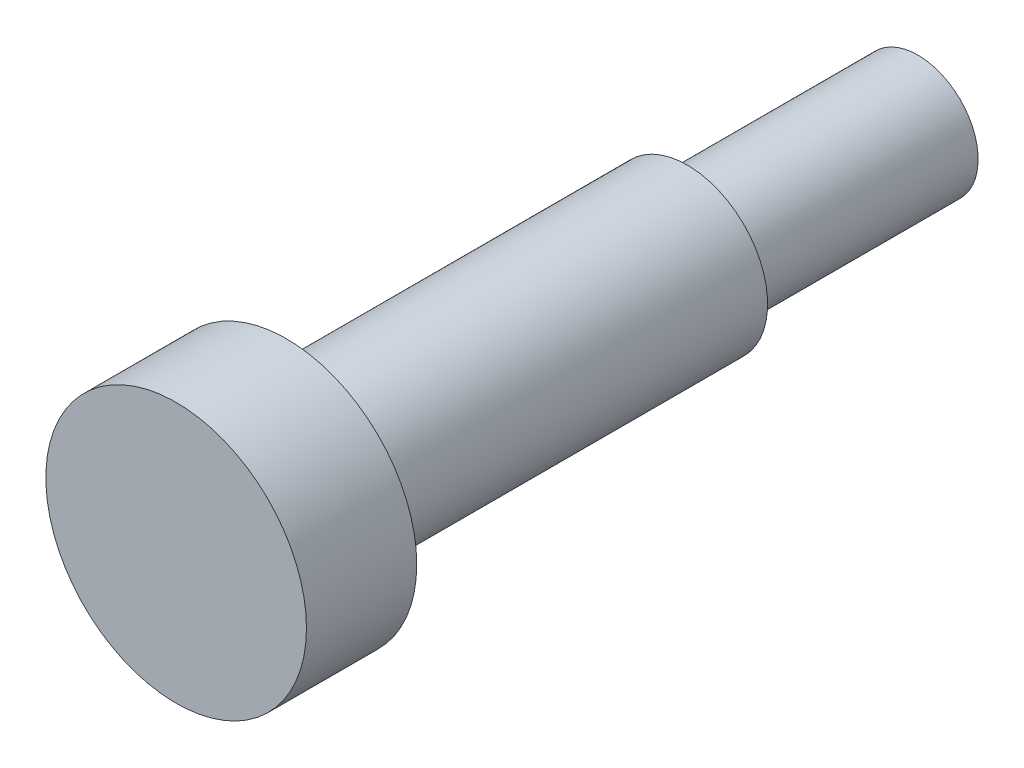
ISO-10303-21;
HEADER;
FILE_DESCRIPTION(('STEP AP214'),'2;1');
FILE_NAME('part.step','',(''),(''),'','','');
FILE_SCHEMA(('AUTOMOTIVE_DESIGN { 1 0 10303 214 1 1 1 1 }'));
ENDSEC;
DATA;
#1=APPLICATION_CONTEXT('core data for automotive mechanical design processes');
#2=APPLICATION_PROTOCOL_DEFINITION('international standard','automotive_design',2000,#1);
#3=PRODUCT_CONTEXT('',#1,'mechanical');
#4=PRODUCT('Part','Part','',(#3));
#5=PRODUCT_RELATED_PRODUCT_CATEGORY('part','',(#4));
#6=PRODUCT_DEFINITION_FORMATION('','',#4);
#7=PRODUCT_DEFINITION_CONTEXT('part definition',#1,'design');
#8=PRODUCT_DEFINITION('design','',#6,#7);
#9=PRODUCT_DEFINITION_SHAPE('','',#8);
#10=(LENGTH_UNIT() NAMED_UNIT(*) SI_UNIT(.MILLI.,.METRE.));
#11=(NAMED_UNIT(*) PLANE_ANGLE_UNIT() SI_UNIT($,.RADIAN.));
#12=(NAMED_UNIT(*) SI_UNIT($,.STERADIAN.) SOLID_ANGLE_UNIT());
#13=UNCERTAINTY_MEASURE_WITH_UNIT(LENGTH_MEASURE(1.E-05),#10,'distance_accuracy_value','');
#14=(GEOMETRIC_REPRESENTATION_CONTEXT(3) GLOBAL_UNCERTAINTY_ASSIGNED_CONTEXT((#13)) GLOBAL_UNIT_ASSIGNED_CONTEXT((#10,
#11,#12)) REPRESENTATION_CONTEXT('',''));
#15=CARTESIAN_POINT('',(0.,0.,0.));
#16=DIRECTION('',(0.,0.,1.));
#17=DIRECTION('',(1.,0.,0.));
#18=AXIS2_PLACEMENT_3D('',#15,#16,#17);
#19=CARTESIAN_POINT('',(0.,0.,-5.5));
#20=DIRECTION('',(0.,0.,1.));
#21=DIRECTION('',(1.,0.,0.));
#22=AXIS2_PLACEMENT_3D('',#19,#20,#21);
#23=CYLINDRICAL_SURFACE('',#22,6.5);
#24=CARTESIAN_POINT('',(0.,0.,-5.5));
#25=DIRECTION('',(0.,0.,1.));
#26=DIRECTION('',(1.,0.,0.));
#27=AXIS2_PLACEMENT_3D('',#24,#25,#26);
#28=CIRCLE('',#27,6.5);
#29=CARTESIAN_POINT('',(6.5,0.,-5.5));
#30=VERTEX_POINT('',#29);
#31=EDGE_CURVE('E52',#30,#30,#28,.T.);
#32=ORIENTED_EDGE('',*,*,#31,.T.);
#33=EDGE_LOOP('',(#32));
#34=FACE_BOUND('',#33,.T.);
#35=CARTESIAN_POINT('',(0.,0.,0.));
#36=DIRECTION('',(0.,0.,1.));
#37=DIRECTION('',(1.,0.,0.));
#38=AXIS2_PLACEMENT_3D('',#35,#36,#37);
#39=CIRCLE('',#38,6.5);
#40=CARTESIAN_POINT('',(6.5,0.,0.));
#41=VERTEX_POINT('',#40);
#42=EDGE_CURVE('E42',#41,#41,#39,.T.);
#43=ORIENTED_EDGE('',*,*,#42,.F.);
#44=EDGE_LOOP('',(#43));
#45=FACE_BOUND('',#44,.T.);
#46=ADVANCED_FACE('F41',(#34,#45),#23,.T.);
#47=CARTESIAN_POINT('',(0.,0.,-5.5));
#48=DIRECTION('',(0.,0.,1.));
#49=DIRECTION('',(1.,0.,0.));
#50=AXIS2_PLACEMENT_3D('',#47,#48,#49);
#51=PLANE('',#50);
#52=CARTESIAN_POINT('',(0.,0.,-5.5));
#53=DIRECTION('',(0.,0.,-1.));
#54=DIRECTION('',(-1.,0.,0.));
#55=AXIS2_PLACEMENT_3D('',#52,#53,#54);
#56=CIRCLE('',#55,4.);
#57=CARTESIAN_POINT('',(-4.,0.,-5.5));
#58=VERTEX_POINT('',#57);
#59=EDGE_CURVE('E48',#58,#58,#56,.T.);
#60=ORIENTED_EDGE('',*,*,#59,.F.);
#61=EDGE_LOOP('',(#60));
#62=FACE_BOUND('',#61,.T.);
#63=ORIENTED_EDGE('',*,*,#31,.F.);
#64=EDGE_LOOP('',(#63));
#65=FACE_BOUND('',#64,.T.);
#66=ADVANCED_FACE('F66',(#62,#65),#51,.F.);
#67=CARTESIAN_POINT('',(0.,0.,0.));
#68=DIRECTION('',(0.,0.,1.));
#69=DIRECTION('',(1.,0.,0.));
#70=AXIS2_PLACEMENT_3D('',#67,#68,#69);
#71=PLANE('',#70);
#72=ORIENTED_EDGE('',*,*,#42,.T.);
#73=EDGE_LOOP('',(#72));
#74=FACE_BOUND('',#73,.T.);
#75=ADVANCED_FACE('F67',(#74),#71,.T.);
#76=CARTESIAN_POINT('',(0.,0.,-25.5));
#77=DIRECTION('',(0.,0.,1.));
#78=DIRECTION('',(1.,0.,0.));
#79=AXIS2_PLACEMENT_3D('',#76,#77,#78);
#80=CYLINDRICAL_SURFACE('',#79,4.);
#81=CARTESIAN_POINT('',(0.,0.,-25.5));
#82=DIRECTION('',(0.,0.,-1.));
#83=DIRECTION('',(-1.,0.,0.));
#84=AXIS2_PLACEMENT_3D('',#81,#82,#83);
#85=CIRCLE('',#84,4.);
#86=CARTESIAN_POINT('',(-4.,0.,-25.5));
#87=VERTEX_POINT('',#86);
#88=EDGE_CURVE('E59',#87,#87,#85,.T.);
#89=ORIENTED_EDGE('',*,*,#88,.F.);
#90=EDGE_LOOP('',(#89));
#91=FACE_BOUND('',#90,.T.);
#92=ORIENTED_EDGE('',*,*,#59,.T.);
#93=EDGE_LOOP('',(#92));
#94=FACE_BOUND('',#93,.T.);
#95=ADVANCED_FACE('F80',(#91,#94),#80,.T.);
#96=CARTESIAN_POINT('',(0.,0.,-25.5));
#97=DIRECTION('',(0.,0.,-1.));
#98=DIRECTION('',(-1.,0.,0.));
#99=AXIS2_PLACEMENT_3D('',#96,#97,#98);
#100=PLANE('',#99);
#101=CARTESIAN_POINT('',(0.,0.,-25.5));
#102=DIRECTION('',(0.,0.,-1.));
#103=DIRECTION('',(-1.,0.,0.));
#104=AXIS2_PLACEMENT_3D('',#101,#102,#103);
#105=CIRCLE('',#104,3.);
#106=CARTESIAN_POINT('',(-3.,0.,-25.5));
#107=VERTEX_POINT('',#106);
#108=EDGE_CURVE('E10',#107,#107,#105,.T.);
#109=ORIENTED_EDGE('',*,*,#108,.F.);
#110=EDGE_LOOP('',(#109));
#111=FACE_BOUND('',#110,.T.);
#112=ORIENTED_EDGE('',*,*,#88,.T.);
#113=EDGE_LOOP('',(#112));
#114=FACE_BOUND('',#113,.T.);
#115=ADVANCED_FACE('F81',(#111,#114),#100,.T.);
#116=CARTESIAN_POINT('',(0.,0.,-37.));
#117=DIRECTION('',(0.,0.,1.));
#118=DIRECTION('',(1.,0.,0.));
#119=AXIS2_PLACEMENT_3D('',#116,#117,#118);
#120=CYLINDRICAL_SURFACE('',#119,3.);
#121=CARTESIAN_POINT('',(0.,0.,-37.));
#122=DIRECTION('',(0.,0.,-1.));
#123=DIRECTION('',(-1.,0.,0.));
#124=AXIS2_PLACEMENT_3D('',#121,#122,#123);
#125=CIRCLE('',#124,3.);
#126=CARTESIAN_POINT('',(-3.,0.,-37.));
#127=VERTEX_POINT('',#126);
#128=EDGE_CURVE('E60',#127,#127,#125,.T.);
#129=ORIENTED_EDGE('',*,*,#128,.F.);
#130=EDGE_LOOP('',(#129));
#131=FACE_BOUND('',#130,.T.);
#132=ORIENTED_EDGE('',*,*,#108,.T.);
#133=EDGE_LOOP('',(#132));
#134=FACE_BOUND('',#133,.T.);
#135=ADVANCED_FACE('F86',(#131,#134),#120,.T.);
#136=CARTESIAN_POINT('',(0.,0.,-37.));
#137=DIRECTION('',(0.,0.,-1.));
#138=DIRECTION('',(-1.,0.,0.));
#139=AXIS2_PLACEMENT_3D('',#136,#137,#138);
#140=PLANE('',#139);
#141=ORIENTED_EDGE('',*,*,#128,.T.);
#142=EDGE_LOOP('',(#141));
#143=FACE_BOUND('',#142,.T.);
#144=ADVANCED_FACE('F95',(#143),#140,.T.);
#145=CLOSED_SHELL('',(#46,#66,#75,#95,#115,#135,#144));
#146=MANIFOLD_SOLID_BREP('B2',#145);
#147=ADVANCED_BREP_SHAPE_REPRESENTATION('',(#18,#146),#14);
#148=SHAPE_DEFINITION_REPRESENTATION(#9,#147);
ENDSEC;
END-ISO-10303-21;
